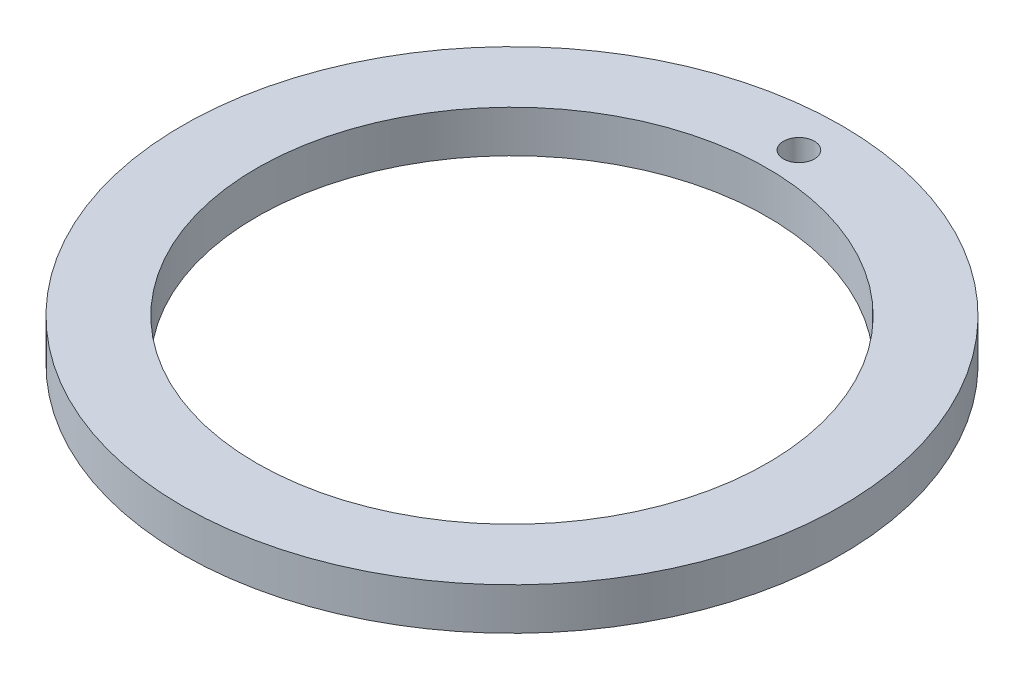
ISO-10303-21;
HEADER;
FILE_DESCRIPTION(('STEP AP214'),'2;1');
FILE_NAME('part.step','',(''),(''),'','','');
FILE_SCHEMA(('AUTOMOTIVE_DESIGN { 1 0 10303 214 1 1 1 1 }'));
ENDSEC;
DATA;
#1=APPLICATION_CONTEXT('core data for automotive mechanical design processes');
#2=APPLICATION_PROTOCOL_DEFINITION('international standard','automotive_design',2000,#1);
#3=PRODUCT_CONTEXT('',#1,'mechanical');
#4=PRODUCT('Part','Part','',(#3));
#5=PRODUCT_RELATED_PRODUCT_CATEGORY('part','',(#4));
#6=PRODUCT_DEFINITION_FORMATION('','',#4);
#7=PRODUCT_DEFINITION_CONTEXT('part definition',#1,'design');
#8=PRODUCT_DEFINITION('design','',#6,#7);
#9=PRODUCT_DEFINITION_SHAPE('','',#8);
#10=(LENGTH_UNIT() NAMED_UNIT(*) SI_UNIT(.MILLI.,.METRE.));
#11=(NAMED_UNIT(*) PLANE_ANGLE_UNIT() SI_UNIT($,.RADIAN.));
#12=(NAMED_UNIT(*) SI_UNIT($,.STERADIAN.) SOLID_ANGLE_UNIT());
#13=UNCERTAINTY_MEASURE_WITH_UNIT(LENGTH_MEASURE(1.E-05),#10,'distance_accuracy_value','');
#14=(GEOMETRIC_REPRESENTATION_CONTEXT(3) GLOBAL_UNCERTAINTY_ASSIGNED_CONTEXT((#13)) GLOBAL_UNIT_ASSIGNED_CONTEXT((#10,
#11,#12)) REPRESENTATION_CONTEXT('',''));
#15=CARTESIAN_POINT('',(0.,0.,0.));
#16=DIRECTION('',(0.,0.,1.));
#17=DIRECTION('',(1.,0.,0.));
#18=AXIS2_PLACEMENT_3D('',#15,#16,#17);
#19=CARTESIAN_POINT('',(0.,6.477,0.));
#20=DIRECTION('',(0.,1.,0.));
#21=DIRECTION('',(0.,0.,1.));
#22=AXIS2_PLACEMENT_3D('',#19,#20,#21);
#23=PLANE('',#22);
#24=CARTESIAN_POINT('',(0.,6.477,0.));
#25=DIRECTION('',(0.,1.,0.));
#26=DIRECTION('',(0.,0.,1.));
#27=AXIS2_PLACEMENT_3D('',#24,#25,#26);
#28=CIRCLE('',#27,39.37);
#29=CARTESIAN_POINT('',(0.,6.477,39.37));
#30=VERTEX_POINT('',#29);
#31=EDGE_CURVE('E50',#30,#30,#28,.T.);
#32=ORIENTED_EDGE('',*,*,#31,.F.);
#33=EDGE_LOOP('',(#32));
#34=FACE_BOUND('',#33,.T.);
#35=CARTESIAN_POINT('',(0.,6.477,0.));
#36=DIRECTION('',(0.,1.,0.));
#37=DIRECTION('',(0.,0.,1.));
#38=AXIS2_PLACEMENT_3D('',#35,#36,#37);
#39=CIRCLE('',#38,50.8);
#40=CARTESIAN_POINT('',(0.,6.477,50.8));
#41=VERTEX_POINT('',#40);
#42=EDGE_CURVE('E10',#41,#41,#39,.T.);
#43=ORIENTED_EDGE('',*,*,#42,.T.);
#44=EDGE_LOOP('',(#43));
#45=FACE_BOUND('',#44,.T.);
#46=CARTESIAN_POINT('',(0.,6.477,-44.22775));
#47=DIRECTION('',(0.,1.,0.));
#48=DIRECTION('',(0.,0.,1.));
#49=AXIS2_PLACEMENT_3D('',#46,#47,#48);
#50=CIRCLE('',#49,2.38125);
#51=CARTESIAN_POINT('',(0.,6.477,-41.8465));
#52=VERTEX_POINT('',#51);
#53=EDGE_CURVE('E56',#52,#52,#50,.T.);
#54=ORIENTED_EDGE('',*,*,#53,.F.);
#55=EDGE_LOOP('',(#54));
#56=FACE_BOUND('',#55,.T.);
#57=ADVANCED_FACE('F37',(#34,#45,#56),#23,.T.);
#58=CARTESIAN_POINT('',(0.,0.,0.));
#59=DIRECTION('',(0.,1.,0.));
#60=DIRECTION('',(0.,0.,1.));
#61=AXIS2_PLACEMENT_3D('',#58,#59,#60);
#62=PLANE('',#61);
#63=CARTESIAN_POINT('',(0.,0.,0.));
#64=DIRECTION('',(0.,1.,0.));
#65=DIRECTION('',(0.,0.,1.));
#66=AXIS2_PLACEMENT_3D('',#63,#64,#65);
#67=CIRCLE('',#66,50.8);
#68=CARTESIAN_POINT('',(0.,0.,50.8));
#69=VERTEX_POINT('',#68);
#70=EDGE_CURVE('E41',#69,#69,#67,.T.);
#71=ORIENTED_EDGE('',*,*,#70,.F.);
#72=EDGE_LOOP('',(#71));
#73=FACE_BOUND('',#72,.T.);
#74=CARTESIAN_POINT('',(0.,0.,0.));
#75=DIRECTION('',(0.,1.,0.));
#76=DIRECTION('',(0.,0.,1.));
#77=AXIS2_PLACEMENT_3D('',#74,#75,#76);
#78=CIRCLE('',#77,39.37);
#79=CARTESIAN_POINT('',(0.,0.,39.37));
#80=VERTEX_POINT('',#79);
#81=EDGE_CURVE('E52',#80,#80,#78,.T.);
#82=ORIENTED_EDGE('',*,*,#81,.T.);
#83=EDGE_LOOP('',(#82));
#84=FACE_BOUND('',#83,.T.);
#85=CARTESIAN_POINT('',(0.,0.,-44.22775));
#86=DIRECTION('',(0.,1.,0.));
#87=DIRECTION('',(0.,0.,1.));
#88=AXIS2_PLACEMENT_3D('',#85,#86,#87);
#89=CIRCLE('',#88,2.38125);
#90=CARTESIAN_POINT('',(0.,0.,-41.8465));
#91=VERTEX_POINT('',#90);
#92=EDGE_CURVE('E60',#91,#91,#89,.T.);
#93=ORIENTED_EDGE('',*,*,#92,.T.);
#94=EDGE_LOOP('',(#93));
#95=FACE_BOUND('',#94,.T.);
#96=ADVANCED_FACE('F72',(#73,#84,#95),#62,.F.);
#97=CARTESIAN_POINT('',(0.,6.477,0.));
#98=DIRECTION('',(0.,-1.,0.));
#99=DIRECTION('',(0.,0.,-1.));
#100=AXIS2_PLACEMENT_3D('',#97,#98,#99);
#101=CYLINDRICAL_SURFACE('',#100,50.8);
#102=ORIENTED_EDGE('',*,*,#42,.F.);
#103=EDGE_LOOP('',(#102));
#104=FACE_BOUND('',#103,.T.);
#105=ORIENTED_EDGE('',*,*,#70,.T.);
#106=EDGE_LOOP('',(#105));
#107=FACE_BOUND('',#106,.T.);
#108=ADVANCED_FACE('F39',(#104,#107),#101,.T.);
#109=CARTESIAN_POINT('',(0.,6.477,0.));
#110=DIRECTION('',(0.,-1.,0.));
#111=DIRECTION('',(0.,0.,-1.));
#112=AXIS2_PLACEMENT_3D('',#109,#110,#111);
#113=CYLINDRICAL_SURFACE('',#112,39.37);
#114=ORIENTED_EDGE('',*,*,#31,.T.);
#115=EDGE_LOOP('',(#114));
#116=FACE_BOUND('',#115,.T.);
#117=ORIENTED_EDGE('',*,*,#81,.F.);
#118=EDGE_LOOP('',(#117));
#119=FACE_BOUND('',#118,.T.);
#120=ADVANCED_FACE('F81',(#116,#119),#113,.F.);
#121=CARTESIAN_POINT('',(0.,6.477,-44.22775));
#122=DIRECTION('',(0.,-1.,0.));
#123=DIRECTION('',(0.,0.,-1.));
#124=AXIS2_PLACEMENT_3D('',#121,#122,#123);
#125=CYLINDRICAL_SURFACE('',#124,2.38125);
#126=ORIENTED_EDGE('',*,*,#53,.T.);
#127=EDGE_LOOP('',(#126));
#128=FACE_BOUND('',#127,.T.);
#129=ORIENTED_EDGE('',*,*,#92,.F.);
#130=EDGE_LOOP('',(#129));
#131=FACE_BOUND('',#130,.T.);
#132=ADVANCED_FACE('F68',(#128,#131),#125,.F.);
#133=CLOSED_SHELL('',(#57,#96,#108,#120,#132));
#134=MANIFOLD_SOLID_BREP('B2',#133);
#135=ADVANCED_BREP_SHAPE_REPRESENTATION('',(#18,#134),#14);
#136=SHAPE_DEFINITION_REPRESENTATION(#9,#135);
ENDSEC;
END-ISO-10303-21;
